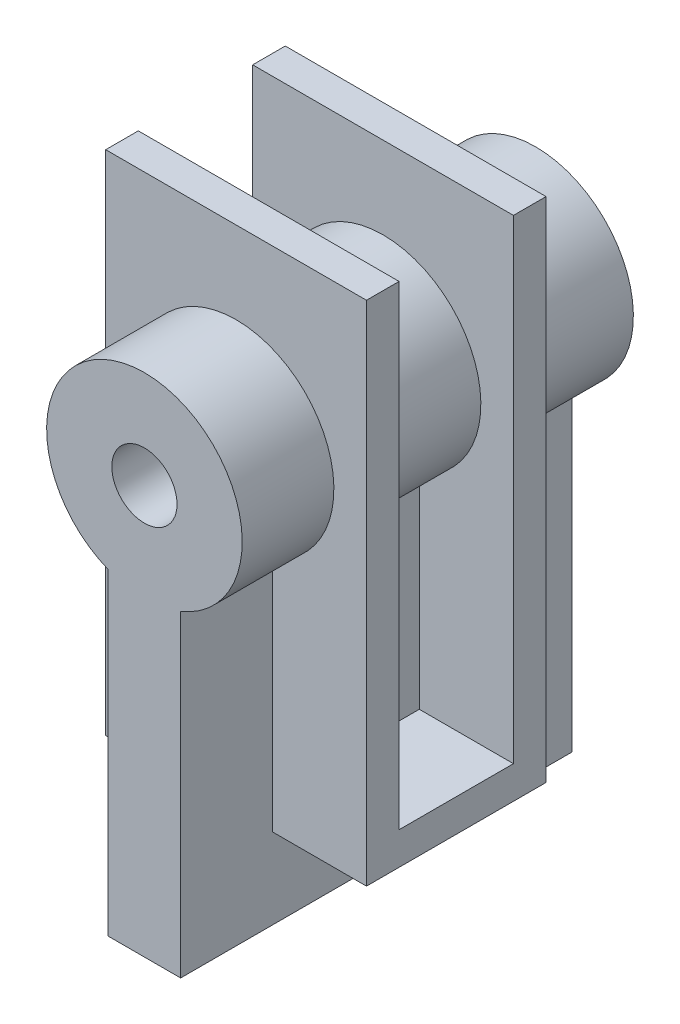
ISO-10303-21;
HEADER;
FILE_DESCRIPTION(('STEP AP214'),'2;1');
FILE_NAME('part.step','',(''),(''),'','','');
FILE_SCHEMA(('AUTOMOTIVE_DESIGN { 1 0 10303 214 1 1 1 1 }'));
ENDSEC;
DATA;
#1=APPLICATION_CONTEXT('core data for automotive mechanical design processes');
#2=APPLICATION_PROTOCOL_DEFINITION('international standard','automotive_design',2000,#1);
#3=PRODUCT_CONTEXT('',#1,'mechanical');
#4=PRODUCT('Part','Part','',(#3));
#5=PRODUCT_RELATED_PRODUCT_CATEGORY('part','',(#4));
#6=PRODUCT_DEFINITION_FORMATION('','',#4);
#7=PRODUCT_DEFINITION_CONTEXT('part definition',#1,'design');
#8=PRODUCT_DEFINITION('design','',#6,#7);
#9=PRODUCT_DEFINITION_SHAPE('','',#8);
#10=(LENGTH_UNIT() NAMED_UNIT(*) SI_UNIT(.MILLI.,.METRE.));
#11=(NAMED_UNIT(*) PLANE_ANGLE_UNIT() SI_UNIT($,.RADIAN.));
#12=(NAMED_UNIT(*) SI_UNIT($,.STERADIAN.) SOLID_ANGLE_UNIT());
#13=UNCERTAINTY_MEASURE_WITH_UNIT(LENGTH_MEASURE(1.E-05),#10,'distance_accuracy_value','');
#14=(GEOMETRIC_REPRESENTATION_CONTEXT(3) GLOBAL_UNCERTAINTY_ASSIGNED_CONTEXT((#13)) GLOBAL_UNIT_ASSIGNED_CONTEXT((#10,
#11,#12)) REPRESENTATION_CONTEXT('',''));
#15=CARTESIAN_POINT('',(0.,0.,0.));
#16=DIRECTION('',(0.,0.,1.));
#17=DIRECTION('',(1.,0.,0.));
#18=AXIS2_PLACEMENT_3D('',#15,#16,#17);
#19=CARTESIAN_POINT('',(-20.,-45.2531458099855,-6.6055019568257));
#20=DIRECTION('',(0.,1.,0.));
#21=DIRECTION('',(0.,0.,1.));
#22=AXIS2_PLACEMENT_3D('',#19,#20,#21);
#23=PLANE('',#22);
#24=DIRECTION('',(1.,0.,0.));
#25=VECTOR('',#24,1.);
#26=CARTESIAN_POINT('',(-20.,-45.2531458099855,10.9381302617935));
#27=LINE('',#26,#25);
#28=CARTESIAN_POINT('',(-20.,-45.2531458099855,10.9381302617935));
#29=VERTEX_POINT('',#28);
#30=CARTESIAN_POINT('',(20.,-45.2531458099855,10.9381302617935));
#31=VERTEX_POINT('',#30);
#32=EDGE_CURVE('E52',#29,#31,#27,.T.);
#33=ORIENTED_EDGE('',*,*,#32,.T.);
#34=DIRECTION('',(0.,0.,1.));
#35=VECTOR('',#34,1.);
#36=CARTESIAN_POINT('',(20.,-45.2531458099855,-6.6055019568257));
#37=LINE('',#36,#35);
#38=CARTESIAN_POINT('',(20.,-45.2531458099855,-6.6055019568257));
#39=VERTEX_POINT('',#38);
#40=EDGE_CURVE('E113',#39,#31,#37,.T.);
#41=ORIENTED_EDGE('',*,*,#40,.F.);
#42=DIRECTION('',(1.,0.,0.));
#43=VECTOR('',#42,1.);
#44=CARTESIAN_POINT('',(-20.,-45.2531458099855,-6.6055019568257));
#45=LINE('',#44,#43);
#46=CARTESIAN_POINT('',(-20.,-45.2531458099855,-6.6055019568257));
#47=VERTEX_POINT('',#46);
#48=EDGE_CURVE('E12',#47,#39,#45,.T.);
#49=ORIENTED_EDGE('',*,*,#48,.F.);
#50=DIRECTION('',(0.,0.,1.));
#51=VECTOR('',#50,1.);
#52=CARTESIAN_POINT('',(-20.,-45.2531458099855,-6.6055019568257));
#53=LINE('',#52,#51);
#54=EDGE_CURVE('E114',#47,#29,#53,.T.);
#55=ORIENTED_EDGE('',*,*,#54,.T.);
#56=EDGE_LOOP('',(#33,#41,#49,#55));
#57=FACE_BOUND('',#56,.T.);
#58=ADVANCED_FACE('F49',(#57),#23,.T.);
#59=CARTESIAN_POINT('',(-20.,-45.2531458099855,-6.6055019568257));
#60=DIRECTION('',(0.,0.,1.));
#61=DIRECTION('',(1.,0.,0.));
#62=AXIS2_PLACEMENT_3D('',#59,#60,#61);
#63=PLANE('',#62);
#64=ORIENTED_EDGE('',*,*,#48,.T.);
#65=DIRECTION('',(0.,-1.,0.));
#66=VECTOR('',#65,1.);
#67=CARTESIAN_POINT('',(20.,-45.2531458099855,-6.6055019568257));
#68=LINE('',#67,#66);
#69=CARTESIAN_POINT('',(20.,27.5804653060911,-6.6055019568257));
#70=VERTEX_POINT('',#69);
#71=EDGE_CURVE('E131',#70,#39,#68,.T.);
#72=ORIENTED_EDGE('',*,*,#71,.F.);
#73=DIRECTION('',(1.,0.,0.));
#74=VECTOR('',#73,1.);
#75=CARTESIAN_POINT('',(-20.,27.5804653060911,-6.6055019568257));
#76=LINE('',#75,#74);
#77=CARTESIAN_POINT('',(-20.,27.5804653060911,-6.6055019568257));
#78=VERTEX_POINT('',#77);
#79=EDGE_CURVE('E57',#78,#70,#76,.T.);
#80=ORIENTED_EDGE('',*,*,#79,.F.);
#81=DIRECTION('',(0.,-1.,0.));
#82=VECTOR('',#81,1.);
#83=CARTESIAN_POINT('',(-20.,-45.2531458099855,-6.6055019568257));
#84=LINE('',#83,#82);
#85=EDGE_CURVE('E119',#78,#47,#84,.T.);
#86=ORIENTED_EDGE('',*,*,#85,.T.);
#87=EDGE_LOOP('',(#64,#72,#80,#86));
#88=FACE_BOUND('',#87,.T.);
#89=ADVANCED_FACE('F195',(#88),#63,.T.);
#90=CARTESIAN_POINT('',(-20.,27.5804653060911,-6.6055019568257));
#91=DIRECTION('',(0.,1.,0.));
#92=DIRECTION('',(0.,0.,1.));
#93=AXIS2_PLACEMENT_3D('',#90,#91,#92);
#94=PLANE('',#93);
#95=ORIENTED_EDGE('',*,*,#79,.T.);
#96=DIRECTION('',(0.,0.,1.));
#97=VECTOR('',#96,1.);
#98=CARTESIAN_POINT('',(20.,27.5804653060911,-6.6055019568257));
#99=LINE('',#98,#97);
#100=CARTESIAN_POINT('',(20.,27.5804653060911,-11.6055019568257));
#101=VERTEX_POINT('',#100);
#102=EDGE_CURVE('E144',#101,#70,#99,.T.);
#103=ORIENTED_EDGE('',*,*,#102,.F.);
#104=DIRECTION('',(1.,0.,0.));
#105=VECTOR('',#104,1.);
#106=CARTESIAN_POINT('',(-20.,27.5804653060911,-11.6055019568257));
#107=LINE('',#106,#105);
#108=CARTESIAN_POINT('',(-20.,27.5804653060911,-11.6055019568257));
#109=VERTEX_POINT('',#108);
#110=EDGE_CURVE('E166',#109,#101,#107,.T.);
#111=ORIENTED_EDGE('',*,*,#110,.F.);
#112=DIRECTION('',(0.,0.,1.));
#113=VECTOR('',#112,1.);
#114=CARTESIAN_POINT('',(-20.,27.5804653060911,-6.6055019568257));
#115=LINE('',#114,#113);
#116=EDGE_CURVE('E162',#109,#78,#115,.T.);
#117=ORIENTED_EDGE('',*,*,#116,.T.);
#118=EDGE_LOOP('',(#95,#103,#111,#117));
#119=FACE_BOUND('',#118,.T.);
#120=ADVANCED_FACE('F194',(#119),#94,.T.);
#121=CARTESIAN_POINT('',(-20.,-50.2531458099855,-11.6055019568257));
#122=DIRECTION('',(0.,0.,-1.));
#123=DIRECTION('',(-1.,0.,0.));
#124=AXIS2_PLACEMENT_3D('',#121,#122,#123);
#125=PLANE('',#124);
#126=ORIENTED_EDGE('',*,*,#110,.T.);
#127=DIRECTION('',(0.,1.,0.));
#128=VECTOR('',#127,1.);
#129=CARTESIAN_POINT('',(20.,-50.2531458099855,-11.6055019568257));
#130=LINE('',#129,#128);
#131=CARTESIAN_POINT('',(20.,-50.2531458099855,-11.6055019568257));
#132=VERTEX_POINT('',#131);
#133=EDGE_CURVE('E141',#132,#101,#130,.T.);
#134=ORIENTED_EDGE('',*,*,#133,.F.);
#135=DIRECTION('',(1.,0.,0.));
#136=VECTOR('',#135,1.);
#137=CARTESIAN_POINT('',(-20.,-50.2531458099855,-11.6055019568257));
#138=LINE('',#137,#136);
#139=CARTESIAN_POINT('',(-20.,-50.2531458099855,-11.6055019568257));
#140=VERTEX_POINT('',#139);
#141=EDGE_CURVE('E168',#140,#132,#138,.T.);
#142=ORIENTED_EDGE('',*,*,#141,.F.);
#143=DIRECTION('',(0.,1.,0.));
#144=VECTOR('',#143,1.);
#145=CARTESIAN_POINT('',(-20.,-50.2531458099855,-11.6055019568257));
#146=LINE('',#145,#144);
#147=EDGE_CURVE('E159',#140,#109,#146,.T.);
#148=ORIENTED_EDGE('',*,*,#147,.T.);
#149=EDGE_LOOP('',(#126,#134,#142,#148));
#150=FACE_BOUND('',#149,.T.);
#151=ADVANCED_FACE('F190',(#150),#125,.T.);
#152=CARTESIAN_POINT('',(-20.,-50.2531458099855,-11.6055019568257));
#153=DIRECTION('',(0.,-1.,0.));
#154=DIRECTION('',(0.,0.,-1.));
#155=AXIS2_PLACEMENT_3D('',#152,#153,#154);
#156=PLANE('',#155);
#157=ORIENTED_EDGE('',*,*,#141,.T.);
#158=DIRECTION('',(0.,0.,-1.));
#159=VECTOR('',#158,1.);
#160=CARTESIAN_POINT('',(20.,-50.2531458099855,-11.6055019568257));
#161=LINE('',#160,#159);
#162=CARTESIAN_POINT('',(20.,-50.2531458099855,15.9381302617935));
#163=VERTEX_POINT('',#162);
#164=EDGE_CURVE('E138',#163,#132,#161,.T.);
#165=ORIENTED_EDGE('',*,*,#164,.F.);
#166=DIRECTION('',(1.,0.,0.));
#167=VECTOR('',#166,1.);
#168=CARTESIAN_POINT('',(-20.,-50.2531458099855,15.9381302617935));
#169=LINE('',#168,#167);
#170=CARTESIAN_POINT('',(-20.,-50.2531458099855,15.9381302617935));
#171=VERTEX_POINT('',#170);
#172=EDGE_CURVE('E170',#171,#163,#169,.T.);
#173=ORIENTED_EDGE('',*,*,#172,.F.);
#174=DIRECTION('',(0.,0.,-1.));
#175=VECTOR('',#174,1.);
#176=CARTESIAN_POINT('',(-20.,-50.2531458099855,-11.6055019568257));
#177=LINE('',#176,#175);
#178=EDGE_CURVE('E156',#171,#140,#177,.T.);
#179=ORIENTED_EDGE('',*,*,#178,.T.);
#180=EDGE_LOOP('',(#157,#165,#173,#179));
#181=FACE_BOUND('',#180,.T.);
#182=ADVANCED_FACE('F183',(#181),#156,.T.);
#183=CARTESIAN_POINT('',(-20.,-50.2531458099855,15.9381302617935));
#184=DIRECTION('',(0.,0.,1.));
#185=DIRECTION('',(1.,0.,0.));
#186=AXIS2_PLACEMENT_3D('',#183,#184,#185);
#187=PLANE('',#186);
#188=ORIENTED_EDGE('',*,*,#172,.T.);
#189=DIRECTION('',(0.,-1.,0.));
#190=VECTOR('',#189,1.);
#191=CARTESIAN_POINT('',(20.,-50.2531458099855,15.9381302617935));
#192=LINE('',#191,#190);
#193=CARTESIAN_POINT('',(20.,27.5804653060911,15.9381302617935));
#194=VERTEX_POINT('',#193);
#195=EDGE_CURVE('E135',#194,#163,#192,.T.);
#196=ORIENTED_EDGE('',*,*,#195,.F.);
#197=DIRECTION('',(1.,0.,0.));
#198=VECTOR('',#197,1.);
#199=CARTESIAN_POINT('',(-20.,27.5804653060911,15.9381302617935));
#200=LINE('',#199,#198);
#201=CARTESIAN_POINT('',(-20.,27.5804653060911,15.9381302617935));
#202=VERTEX_POINT('',#201);
#203=EDGE_CURVE('E172',#202,#194,#200,.T.);
#204=ORIENTED_EDGE('',*,*,#203,.F.);
#205=DIRECTION('',(0.,-1.,0.));
#206=VECTOR('',#205,1.);
#207=CARTESIAN_POINT('',(-20.,-50.2531458099855,15.9381302617935));
#208=LINE('',#207,#206);
#209=EDGE_CURVE('E153',#202,#171,#208,.T.);
#210=ORIENTED_EDGE('',*,*,#209,.T.);
#211=EDGE_LOOP('',(#188,#196,#204,#210));
#212=FACE_BOUND('',#211,.T.);
#213=ADVANCED_FACE('F180',(#212),#187,.T.);
#214=CARTESIAN_POINT('',(-20.,27.5804653060911,15.9381302617935));
#215=DIRECTION('',(0.,1.,0.));
#216=DIRECTION('',(0.,0.,1.));
#217=AXIS2_PLACEMENT_3D('',#214,#215,#216);
#218=PLANE('',#217);
#219=ORIENTED_EDGE('',*,*,#203,.T.);
#220=DIRECTION('',(0.,0.,1.));
#221=VECTOR('',#220,1.);
#222=CARTESIAN_POINT('',(20.,27.5804653060911,15.9381302617935));
#223=LINE('',#222,#221);
#224=CARTESIAN_POINT('',(20.,27.5804653060911,10.9381302617935));
#225=VERTEX_POINT('',#224);
#226=EDGE_CURVE('E126',#225,#194,#223,.T.);
#227=ORIENTED_EDGE('',*,*,#226,.F.);
#228=DIRECTION('',(1.,0.,0.));
#229=VECTOR('',#228,1.);
#230=CARTESIAN_POINT('',(-20.,27.5804653060911,10.9381302617935));
#231=LINE('',#230,#229);
#232=CARTESIAN_POINT('',(-20.,27.5804653060911,10.9381302617935));
#233=VERTEX_POINT('',#232);
#234=EDGE_CURVE('E118',#233,#225,#231,.T.);
#235=ORIENTED_EDGE('',*,*,#234,.F.);
#236=DIRECTION('',(0.,0.,1.));
#237=VECTOR('',#236,1.);
#238=CARTESIAN_POINT('',(-20.,27.5804653060911,15.9381302617935));
#239=LINE('',#238,#237);
#240=EDGE_CURVE('E150',#233,#202,#239,.T.);
#241=ORIENTED_EDGE('',*,*,#240,.T.);
#242=EDGE_LOOP('',(#219,#227,#235,#241));
#243=FACE_BOUND('',#242,.T.);
#244=ADVANCED_FACE('F174',(#243),#218,.T.);
#245=CARTESIAN_POINT('',(-20.,-45.2531458099855,10.9381302617935));
#246=DIRECTION('',(0.,0.,-1.));
#247=DIRECTION('',(-1.,0.,0.));
#248=AXIS2_PLACEMENT_3D('',#245,#246,#247);
#249=PLANE('',#248);
#250=ORIENTED_EDGE('',*,*,#234,.T.);
#251=DIRECTION('',(0.,1.,0.));
#252=VECTOR('',#251,1.);
#253=CARTESIAN_POINT('',(20.,-45.2531458099855,10.9381302617935));
#254=LINE('',#253,#252);
#255=EDGE_CURVE('E121',#31,#225,#254,.T.);
#256=ORIENTED_EDGE('',*,*,#255,.F.);
#257=ORIENTED_EDGE('',*,*,#32,.F.);
#258=DIRECTION('',(0.,1.,0.));
#259=VECTOR('',#258,1.);
#260=CARTESIAN_POINT('',(-20.,-45.2531458099855,10.9381302617935));
#261=LINE('',#260,#259);
#262=EDGE_CURVE('E148',#29,#233,#261,.T.);
#263=ORIENTED_EDGE('',*,*,#262,.T.);
#264=EDGE_LOOP('',(#250,#256,#257,#263));
#265=FACE_BOUND('',#264,.T.);
#266=ADVANCED_FACE('F122',(#265),#249,.T.);
#267=CARTESIAN_POINT('',(-20.,0.,-70.));
#268=DIRECTION('',(-1.,0.,0.));
#269=DIRECTION('',(0.,0.,1.));
#270=AXIS2_PLACEMENT_3D('',#267,#268,#269);
#271=PLANE('',#270);
#272=ORIENTED_EDGE('',*,*,#54,.F.);
#273=ORIENTED_EDGE('',*,*,#85,.F.);
#274=ORIENTED_EDGE('',*,*,#116,.F.);
#275=ORIENTED_EDGE('',*,*,#147,.F.);
#276=ORIENTED_EDGE('',*,*,#178,.F.);
#277=ORIENTED_EDGE('',*,*,#209,.F.);
#278=ORIENTED_EDGE('',*,*,#240,.F.);
#279=ORIENTED_EDGE('',*,*,#262,.F.);
#280=EDGE_LOOP('',(#272,#273,#274,#275,#276,#277,#278,#279));
#281=FACE_BOUND('',#280,.T.);
#282=ADVANCED_FACE('F186',(#281),#271,.T.);
#283=CARTESIAN_POINT('',(20.,0.,-70.));
#284=DIRECTION('',(-1.,0.,0.));
#285=DIRECTION('',(0.,0.,1.));
#286=AXIS2_PLACEMENT_3D('',#283,#284,#285);
#287=PLANE('',#286);
#288=ORIENTED_EDGE('',*,*,#40,.T.);
#289=ORIENTED_EDGE('',*,*,#255,.T.);
#290=ORIENTED_EDGE('',*,*,#226,.T.);
#291=ORIENTED_EDGE('',*,*,#195,.T.);
#292=ORIENTED_EDGE('',*,*,#164,.T.);
#293=ORIENTED_EDGE('',*,*,#133,.T.);
#294=ORIENTED_EDGE('',*,*,#102,.T.);
#295=ORIENTED_EDGE('',*,*,#71,.T.);
#296=EDGE_LOOP('',(#288,#289,#290,#291,#292,#293,#294,#295));
#297=FACE_BOUND('',#296,.T.);
#298=ADVANCED_FACE('F129',(#297),#287,.F.);
#299=CLOSED_SHELL('',(#58,#89,#120,#151,#182,#213,#244,#266,#282,#298));
#300=MANIFOLD_SOLID_BREP('B2',#299);
#301=CARTESIAN_POINT('',(0.,0.,-30.));
#302=DIRECTION('',(0.,0.,1.));
#303=DIRECTION('',(1.,0.,0.));
#304=AXIS2_PLACEMENT_3D('',#301,#302,#303);
#305=CYLINDRICAL_SURFACE('',#304,15.);
#306=DIRECTION('',(0.,0.,1.));
#307=VECTOR('',#306,1.);
#308=CARTESIAN_POINT('',(-5.5576064521285,-13.9324445279089,-30.));
#309=LINE('',#308,#307);
#310=CARTESIAN_POINT('',(-5.5576064521285,-13.9324445279089,-30.));
#311=VERTEX_POINT('',#310);
#312=CARTESIAN_POINT('',(-5.5576064521285,-13.9324445279089,30.));
#313=VERTEX_POINT('',#312);
#314=EDGE_CURVE('E280',#311,#313,#309,.T.);
#315=ORIENTED_EDGE('',*,*,#314,.T.);
#316=CARTESIAN_POINT('',(0.,0.,30.));
#317=DIRECTION('',(0.,0.,1.));
#318=DIRECTION('',(1.,0.,0.));
#319=AXIS2_PLACEMENT_3D('',#316,#317,#318);
#320=CIRCLE('',#319,15.);
#321=CARTESIAN_POINT('',(5.5576064521285,-13.9324445279089,30.));
#322=VERTEX_POINT('',#321);
#323=EDGE_CURVE('E317',#322,#313,#320,.T.);
#324=ORIENTED_EDGE('',*,*,#323,.F.);
#325=DIRECTION('',(0.,0.,1.));
#326=VECTOR('',#325,1.);
#327=CARTESIAN_POINT('',(5.5576064521285,-13.9324445279089,-30.));
#328=LINE('',#327,#326);
#329=CARTESIAN_POINT('',(5.5576064521285,-13.9324445279089,-30.));
#330=VERTEX_POINT('',#329);
#331=EDGE_CURVE('E47',#330,#322,#328,.T.);
#332=ORIENTED_EDGE('',*,*,#331,.F.);
#333=CARTESIAN_POINT('',(0.,0.,-30.));
#334=DIRECTION('',(0.,0.,1.));
#335=DIRECTION('',(1.,0.,0.));
#336=AXIS2_PLACEMENT_3D('',#333,#334,#335);
#337=CIRCLE('',#336,15.);
#338=EDGE_CURVE('E318',#330,#311,#337,.T.);
#339=ORIENTED_EDGE('',*,*,#338,.T.);
#340=EDGE_LOOP('',(#315,#324,#332,#339));
#341=FACE_BOUND('',#340,.T.);
#342=ADVANCED_FACE('F277',(#341),#305,.T.);
#343=CARTESIAN_POINT('',(5.5576064521285,-13.9324445279089,-30.));
#344=DIRECTION('',(1.,0.,0.));
#345=DIRECTION('',(0.,1.,0.));
#346=AXIS2_PLACEMENT_3D('',#343,#344,#345);
#347=PLANE('',#346);
#348=ORIENTED_EDGE('',*,*,#331,.T.);
#349=DIRECTION('',(0.,1.,0.));
#350=VECTOR('',#349,1.);
#351=CARTESIAN_POINT('',(5.5576064521285,-13.9324445279089,30.));
#352=LINE('',#351,#350);
#353=CARTESIAN_POINT('',(5.5576064521285,-62.6422800075539,30.));
#354=VERTEX_POINT('',#353);
#355=EDGE_CURVE('E335',#354,#322,#352,.T.);
#356=ORIENTED_EDGE('',*,*,#355,.F.);
#357=DIRECTION('',(0.,0.,1.));
#358=VECTOR('',#357,1.);
#359=CARTESIAN_POINT('',(5.5576064521285,-62.6422800075539,-30.));
#360=LINE('',#359,#358);
#361=CARTESIAN_POINT('',(5.5576064521285,-62.6422800075539,-30.));
#362=VERTEX_POINT('',#361);
#363=EDGE_CURVE('E285',#362,#354,#360,.T.);
#364=ORIENTED_EDGE('',*,*,#363,.F.);
#365=DIRECTION('',(0.,1.,0.));
#366=VECTOR('',#365,1.);
#367=CARTESIAN_POINT('',(5.5576064521285,-13.9324445279089,-30.));
#368=LINE('',#367,#366);
#369=EDGE_CURVE('E323',#362,#330,#368,.T.);
#370=ORIENTED_EDGE('',*,*,#369,.T.);
#371=EDGE_LOOP('',(#348,#356,#364,#370));
#372=FACE_BOUND('',#371,.T.);
#373=ADVANCED_FACE('F356',(#372),#347,.T.);
#374=CARTESIAN_POINT('',(-5.5576064521285,-62.6422800075539,-30.));
#375=DIRECTION('',(0.,-1.,0.));
#376=DIRECTION('',(0.,0.,-1.));
#377=AXIS2_PLACEMENT_3D('',#374,#375,#376);
#378=PLANE('',#377);
#379=ORIENTED_EDGE('',*,*,#363,.T.);
#380=DIRECTION('',(1.,0.,0.));
#381=VECTOR('',#380,1.);
#382=CARTESIAN_POINT('',(-5.5576064521285,-62.6422800075539,30.));
#383=LINE('',#382,#381);
#384=CARTESIAN_POINT('',(-5.5576064521285,-62.6422800075539,30.));
#385=VERTEX_POINT('',#384);
#386=EDGE_CURVE('E330',#385,#354,#383,.T.);
#387=ORIENTED_EDGE('',*,*,#386,.F.);
#388=DIRECTION('',(0.,0.,1.));
#389=VECTOR('',#388,1.);
#390=CARTESIAN_POINT('',(-5.5576064521285,-62.6422800075539,-30.));
#391=LINE('',#390,#389);
#392=CARTESIAN_POINT('',(-5.5576064521285,-62.6422800075539,-30.));
#393=VERTEX_POINT('',#392);
#394=EDGE_CURVE('E322',#393,#385,#391,.T.);
#395=ORIENTED_EDGE('',*,*,#394,.F.);
#396=DIRECTION('',(1.,0.,0.));
#397=VECTOR('',#396,1.);
#398=CARTESIAN_POINT('',(-5.5576064521285,-62.6422800075539,-30.));
#399=LINE('',#398,#397);
#400=EDGE_CURVE('E349',#393,#362,#399,.T.);
#401=ORIENTED_EDGE('',*,*,#400,.T.);
#402=EDGE_LOOP('',(#379,#387,#395,#401));
#403=FACE_BOUND('',#402,.T.);
#404=ADVANCED_FACE('F353',(#403),#378,.T.);
#405=CARTESIAN_POINT('',(-5.5576064521285,-13.9324445279089,-30.));
#406=DIRECTION('',(-1.,0.,0.));
#407=DIRECTION('',(0.,0.,1.));
#408=AXIS2_PLACEMENT_3D('',#405,#406,#407);
#409=PLANE('',#408);
#410=ORIENTED_EDGE('',*,*,#394,.T.);
#411=DIRECTION('',(0.,-1.,0.));
#412=VECTOR('',#411,1.);
#413=CARTESIAN_POINT('',(-5.5576064521285,-13.9324445279089,30.));
#414=LINE('',#413,#412);
#415=EDGE_CURVE('E325',#313,#385,#414,.T.);
#416=ORIENTED_EDGE('',*,*,#415,.F.);
#417=ORIENTED_EDGE('',*,*,#314,.F.);
#418=DIRECTION('',(0.,-1.,0.));
#419=VECTOR('',#418,1.);
#420=CARTESIAN_POINT('',(-5.5576064521285,-13.9324445279089,-30.));
#421=LINE('',#420,#419);
#422=EDGE_CURVE('E347',#311,#393,#421,.T.);
#423=ORIENTED_EDGE('',*,*,#422,.T.);
#424=EDGE_LOOP('',(#410,#416,#417,#423));
#425=FACE_BOUND('',#424,.T.);
#426=ADVANCED_FACE('F326',(#425),#409,.T.);
#427=CARTESIAN_POINT('',(0.,0.,-30.));
#428=DIRECTION('',(0.,0.,1.));
#429=DIRECTION('',(1.,0.,0.));
#430=AXIS2_PLACEMENT_3D('',#427,#428,#429);
#431=PLANE('',#430);
#432=CARTESIAN_POINT('',(0.,0.,-30.));
#433=DIRECTION('',(0.,0.,1.));
#434=DIRECTION('',(1.,0.,0.));
#435=AXIS2_PLACEMENT_3D('',#432,#433,#434);
#436=CIRCLE('',#435,5.);
#437=CARTESIAN_POINT('',(5.,0.,-30.));
#438=VERTEX_POINT('',#437);
#439=EDGE_CURVE('E343',#438,#438,#436,.T.);
#440=ORIENTED_EDGE('',*,*,#439,.T.);
#441=EDGE_LOOP('',(#440));
#442=FACE_BOUND('',#441,.T.);
#443=ORIENTED_EDGE('',*,*,#338,.F.);
#444=ORIENTED_EDGE('',*,*,#369,.F.);
#445=ORIENTED_EDGE('',*,*,#400,.F.);
#446=ORIENTED_EDGE('',*,*,#422,.F.);
#447=EDGE_LOOP('',(#443,#444,#445,#446));
#448=FACE_BOUND('',#447,.T.);
#449=ADVANCED_FACE('F358',(#442,#448),#431,.F.);
#450=CARTESIAN_POINT('',(0.,0.,-30.));
#451=DIRECTION('',(0.,0.,1.));
#452=DIRECTION('',(1.,0.,0.));
#453=AXIS2_PLACEMENT_3D('',#450,#451,#452);
#454=CYLINDRICAL_SURFACE('',#453,5.);
#455=ORIENTED_EDGE('',*,*,#439,.F.);
#456=EDGE_LOOP('',(#455));
#457=FACE_BOUND('',#456,.T.);
#458=CARTESIAN_POINT('',(0.,0.,30.));
#459=DIRECTION('',(0.,0.,1.));
#460=DIRECTION('',(1.,0.,0.));
#461=AXIS2_PLACEMENT_3D('',#458,#459,#460);
#462=CIRCLE('',#461,5.);
#463=CARTESIAN_POINT('',(5.,0.,30.));
#464=VERTEX_POINT('',#463);
#465=EDGE_CURVE('E336',#464,#464,#462,.T.);
#466=ORIENTED_EDGE('',*,*,#465,.T.);
#467=EDGE_LOOP('',(#466));
#468=FACE_BOUND('',#467,.T.);
#469=ADVANCED_FACE('F360',(#457,#468),#454,.F.);
#470=CARTESIAN_POINT('',(0.,0.,30.));
#471=DIRECTION('',(0.,0.,1.));
#472=DIRECTION('',(1.,0.,0.));
#473=AXIS2_PLACEMENT_3D('',#470,#471,#472);
#474=PLANE('',#473);
#475=ORIENTED_EDGE('',*,*,#323,.T.);
#476=ORIENTED_EDGE('',*,*,#415,.T.);
#477=ORIENTED_EDGE('',*,*,#386,.T.);
#478=ORIENTED_EDGE('',*,*,#355,.T.);
#479=EDGE_LOOP('',(#475,#476,#477,#478));
#480=FACE_BOUND('',#479,.T.);
#481=ORIENTED_EDGE('',*,*,#465,.F.);
#482=EDGE_LOOP('',(#481));
#483=FACE_BOUND('',#482,.T.);
#484=ADVANCED_FACE('F333',(#480,#483),#474,.T.);
#485=CLOSED_SHELL('',(#342,#373,#404,#426,#449,#469,#484));
#486=MANIFOLD_SOLID_BREP('B6',#485);
#487=ADVANCED_BREP_SHAPE_REPRESENTATION('',(#18,#300,#486),#14);
#488=SHAPE_DEFINITION_REPRESENTATION(#9,#487);
ENDSEC;
END-ISO-10303-21;
